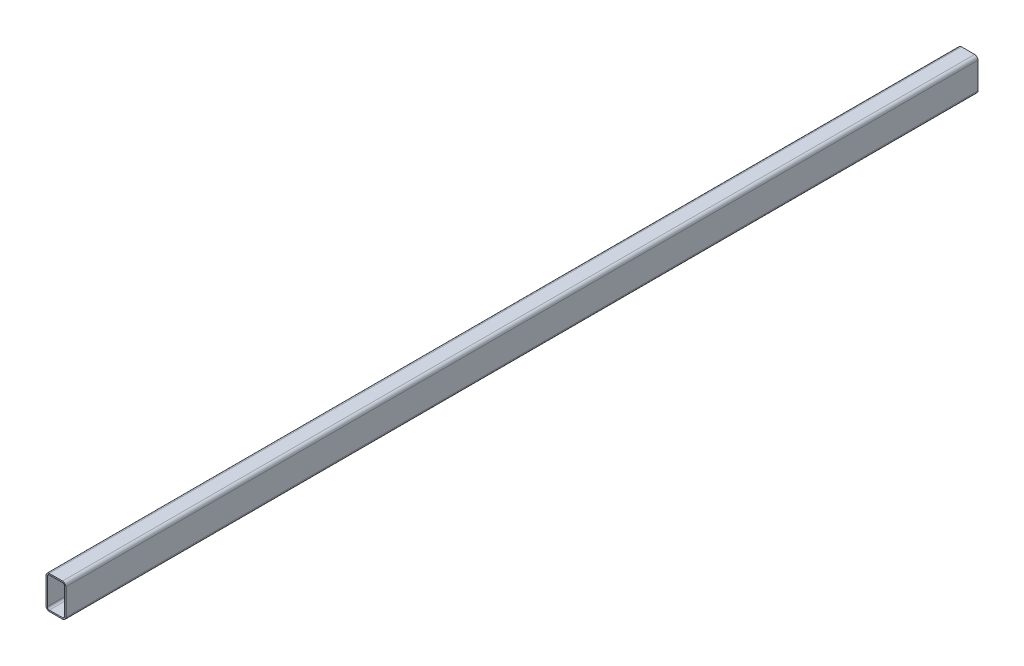
ISO-10303-21;
HEADER;
FILE_DESCRIPTION(('STEP AP214'),'2;1');
FILE_NAME('part.step','',(''),(''),'','','');
FILE_SCHEMA(('AUTOMOTIVE_DESIGN { 1 0 10303 214 1 1 1 1 }'));
ENDSEC;
DATA;
#1=APPLICATION_CONTEXT('core data for automotive mechanical design processes');
#2=APPLICATION_PROTOCOL_DEFINITION('international standard','automotive_design',2000,#1);
#3=PRODUCT_CONTEXT('',#1,'mechanical');
#4=PRODUCT('Part','Part','',(#3));
#5=PRODUCT_RELATED_PRODUCT_CATEGORY('part','',(#4));
#6=PRODUCT_DEFINITION_FORMATION('','',#4);
#7=PRODUCT_DEFINITION_CONTEXT('part definition',#1,'design');
#8=PRODUCT_DEFINITION('design','',#6,#7);
#9=PRODUCT_DEFINITION_SHAPE('','',#8);
#10=(LENGTH_UNIT() NAMED_UNIT(*) SI_UNIT(.MILLI.,.METRE.));
#11=(NAMED_UNIT(*) PLANE_ANGLE_UNIT() SI_UNIT($,.RADIAN.));
#12=(NAMED_UNIT(*) SI_UNIT($,.STERADIAN.) SOLID_ANGLE_UNIT());
#13=UNCERTAINTY_MEASURE_WITH_UNIT(LENGTH_MEASURE(1.E-05),#10,'distance_accuracy_value','');
#14=(GEOMETRIC_REPRESENTATION_CONTEXT(3) GLOBAL_UNCERTAINTY_ASSIGNED_CONTEXT((#13)) GLOBAL_UNIT_ASSIGNED_CONTEXT((#10,
#11,#12)) REPRESENTATION_CONTEXT('',''));
#15=CARTESIAN_POINT('',(0.,0.,0.));
#16=DIRECTION('',(0.,0.,1.));
#17=DIRECTION('',(1.,0.,0.));
#18=AXIS2_PLACEMENT_3D('',#15,#16,#17);
#19=CARTESIAN_POINT('',(-25.,-50.,1725.));
#20=DIRECTION('',(0.,0.,1.));
#21=DIRECTION('',(1.,0.,0.));
#22=AXIS2_PLACEMENT_3D('',#19,#20,#21);
#23=PLANE('',#22);
#24=CARTESIAN_POINT('',(-25.,-50.,1725.));
#25=DIRECTION('',(0.,0.,1.));
#26=DIRECTION('',(1.,0.,0.));
#27=AXIS2_PLACEMENT_3D('',#24,#25,#26);
#28=CIRCLE('',#27,12.5);
#29=CARTESIAN_POINT('',(-37.5,-49.9999999999999,1725.));
#30=VERTEX_POINT('',#29);
#31=CARTESIAN_POINT('',(-24.9999999999999,-62.5,1725.));
#32=VERTEX_POINT('',#31);
#33=EDGE_CURVE('E214',#30,#32,#28,.T.);
#34=ORIENTED_EDGE('',*,*,#33,.T.);
#35=DIRECTION('',(1.,0.,0.));
#36=VECTOR('',#35,1.);
#37=CARTESIAN_POINT('',(-24.9999999999999,-62.5,1725.));
#38=LINE('',#37,#36);
#39=CARTESIAN_POINT('',(24.9999999999999,-62.5,1725.));
#40=VERTEX_POINT('',#39);
#41=EDGE_CURVE('E217',#32,#40,#38,.T.);
#42=ORIENTED_EDGE('',*,*,#41,.T.);
#43=CARTESIAN_POINT('',(25.,-50.,1725.));
#44=DIRECTION('',(0.,0.,1.));
#45=DIRECTION('',(-1.,0.,0.));
#46=AXIS2_PLACEMENT_3D('',#43,#44,#45);
#47=CIRCLE('',#46,12.5);
#48=CARTESIAN_POINT('',(37.5,-49.9999999999999,1725.));
#49=VERTEX_POINT('',#48);
#50=EDGE_CURVE('E220',#40,#49,#47,.T.);
#51=ORIENTED_EDGE('',*,*,#50,.T.);
#52=DIRECTION('',(0.,1.,0.));
#53=VECTOR('',#52,1.);
#54=CARTESIAN_POINT('',(37.5,0.,1725.));
#55=LINE('',#54,#53);
#56=CARTESIAN_POINT('',(37.5,49.9999999999999,1725.));
#57=VERTEX_POINT('',#56);
#58=EDGE_CURVE('E222',#49,#57,#55,.T.);
#59=ORIENTED_EDGE('',*,*,#58,.T.);
#60=CARTESIAN_POINT('',(25.,50.,1725.));
#61=DIRECTION('',(0.,0.,1.));
#62=DIRECTION('',(1.,0.,0.));
#63=AXIS2_PLACEMENT_3D('',#60,#61,#62);
#64=CIRCLE('',#63,12.5);
#65=CARTESIAN_POINT('',(24.9999999999999,62.5,1725.));
#66=VERTEX_POINT('',#65);
#67=EDGE_CURVE('E224',#57,#66,#64,.T.);
#68=ORIENTED_EDGE('',*,*,#67,.T.);
#69=DIRECTION('',(-1.,0.,0.));
#70=VECTOR('',#69,1.);
#71=CARTESIAN_POINT('',(-24.9999999999999,62.5,1725.));
#72=LINE('',#71,#70);
#73=CARTESIAN_POINT('',(-24.9999999999999,62.5,1725.));
#74=VERTEX_POINT('',#73);
#75=EDGE_CURVE('E226',#66,#74,#72,.T.);
#76=ORIENTED_EDGE('',*,*,#75,.T.);
#77=CARTESIAN_POINT('',(-25.,50.,1725.));
#78=DIRECTION('',(0.,0.,1.));
#79=DIRECTION('',(-1.,0.,0.));
#80=AXIS2_PLACEMENT_3D('',#77,#78,#79);
#81=CIRCLE('',#80,12.5);
#82=CARTESIAN_POINT('',(-37.5,49.9999999999999,1725.));
#83=VERTEX_POINT('',#82);
#84=EDGE_CURVE('E228',#74,#83,#81,.T.);
#85=ORIENTED_EDGE('',*,*,#84,.T.);
#86=DIRECTION('',(0.,-1.,0.));
#87=VECTOR('',#86,1.);
#88=CARTESIAN_POINT('',(-37.5,0.,1725.));
#89=LINE('',#88,#87);
#90=EDGE_CURVE('E230',#83,#30,#89,.T.);
#91=ORIENTED_EDGE('',*,*,#90,.T.);
#92=EDGE_LOOP('',(#34,#42,#51,#59,#68,#76,#85,#91));
#93=FACE_BOUND('',#92,.T.);
#94=DIRECTION('',(1.,0.,0.));
#95=VECTOR('',#94,1.);
#96=CARTESIAN_POINT('',(-24.9999999999999,-57.5,1725.));
#97=LINE('',#96,#95);
#98=CARTESIAN_POINT('',(-24.9999999999999,-57.5,1725.));
#99=VERTEX_POINT('',#98);
#100=CARTESIAN_POINT('',(24.9999999999999,-57.5,1725.));
#101=VERTEX_POINT('',#100);
#102=EDGE_CURVE('E156',#99,#101,#97,.T.);
#103=ORIENTED_EDGE('',*,*,#102,.F.);
#104=CARTESIAN_POINT('',(-25.,-50.,1725.));
#105=DIRECTION('',(0.,0.,1.));
#106=DIRECTION('',(1.,0.,0.));
#107=AXIS2_PLACEMENT_3D('',#104,#105,#106);
#108=CIRCLE('',#107,7.5);
#109=CARTESIAN_POINT('',(-32.5,-49.9999999999999,1725.));
#110=VERTEX_POINT('',#109);
#111=EDGE_CURVE('E148',#110,#99,#108,.T.);
#112=ORIENTED_EDGE('',*,*,#111,.F.);
#113=DIRECTION('',(0.,-1.,0.));
#114=VECTOR('',#113,1.);
#115=CARTESIAN_POINT('',(-32.5,0.,1725.));
#116=LINE('',#115,#114);
#117=CARTESIAN_POINT('',(-32.5,49.9999999999999,1725.));
#118=VERTEX_POINT('',#117);
#119=EDGE_CURVE('E181',#118,#110,#116,.T.);
#120=ORIENTED_EDGE('',*,*,#119,.F.);
#121=CARTESIAN_POINT('',(-25.,50.,1725.));
#122=DIRECTION('',(0.,0.,1.));
#123=DIRECTION('',(-1.,0.,0.));
#124=AXIS2_PLACEMENT_3D('',#121,#122,#123);
#125=CIRCLE('',#124,7.5);
#126=CARTESIAN_POINT('',(-25.,57.5,1725.));
#127=VERTEX_POINT('',#126);
#128=EDGE_CURVE('E179',#127,#118,#125,.T.);
#129=ORIENTED_EDGE('',*,*,#128,.F.);
#130=DIRECTION('',(-1.,0.,0.));
#131=VECTOR('',#130,1.);
#132=CARTESIAN_POINT('',(-25.,57.5,1725.));
#133=LINE('',#132,#131);
#134=CARTESIAN_POINT('',(25.,57.5,1725.));
#135=VERTEX_POINT('',#134);
#136=EDGE_CURVE('E177',#135,#127,#133,.T.);
#137=ORIENTED_EDGE('',*,*,#136,.F.);
#138=CARTESIAN_POINT('',(25.,50.,1725.));
#139=DIRECTION('',(0.,0.,1.));
#140=DIRECTION('',(1.,0.,0.));
#141=AXIS2_PLACEMENT_3D('',#138,#139,#140);
#142=CIRCLE('',#141,7.5);
#143=CARTESIAN_POINT('',(32.5,49.9999999999999,1725.));
#144=VERTEX_POINT('',#143);
#145=EDGE_CURVE('E175',#144,#135,#142,.T.);
#146=ORIENTED_EDGE('',*,*,#145,.F.);
#147=DIRECTION('',(0.,1.,0.));
#148=VECTOR('',#147,1.);
#149=CARTESIAN_POINT('',(32.5,0.,1725.));
#150=LINE('',#149,#148);
#151=CARTESIAN_POINT('',(32.5,-49.9999999999999,1725.));
#152=VERTEX_POINT('',#151);
#153=EDGE_CURVE('E171',#152,#144,#150,.T.);
#154=ORIENTED_EDGE('',*,*,#153,.F.);
#155=CARTESIAN_POINT('',(25.,-50.,1725.));
#156=DIRECTION('',(0.,0.,1.));
#157=DIRECTION('',(-1.,0.,0.));
#158=AXIS2_PLACEMENT_3D('',#155,#156,#157);
#159=CIRCLE('',#158,7.5);
#160=EDGE_CURVE('E169',#101,#152,#159,.T.);
#161=ORIENTED_EDGE('',*,*,#160,.F.);
#162=EDGE_LOOP('',(#103,#112,#120,#129,#137,#146,#154,#161));
#163=FACE_BOUND('',#162,.T.);
#164=ADVANCED_FACE('F35',(#93,#163),#23,.T.);
#165=CARTESIAN_POINT('',(-25.,-50.,-1725.));
#166=DIRECTION('',(0.,0.,1.));
#167=DIRECTION('',(1.,0.,0.));
#168=AXIS2_PLACEMENT_3D('',#165,#166,#167);
#169=PLANE('',#168);
#170=CARTESIAN_POINT('',(-25.,-50.,-1725.));
#171=DIRECTION('',(0.,0.,1.));
#172=DIRECTION('',(1.,0.,0.));
#173=AXIS2_PLACEMENT_3D('',#170,#171,#172);
#174=CIRCLE('',#173,12.5);
#175=CARTESIAN_POINT('',(-37.5,-49.9999999999999,-1725.));
#176=VERTEX_POINT('',#175);
#177=CARTESIAN_POINT('',(-24.9999999999999,-62.5,-1725.));
#178=VERTEX_POINT('',#177);
#179=EDGE_CURVE('E164',#176,#178,#174,.T.);
#180=ORIENTED_EDGE('',*,*,#179,.F.);
#181=DIRECTION('',(0.,-1.,0.));
#182=VECTOR('',#181,1.);
#183=CARTESIAN_POINT('',(-37.5,0.,-1725.));
#184=LINE('',#183,#182);
#185=CARTESIAN_POINT('',(-37.5,49.9999999999999,-1725.));
#186=VERTEX_POINT('',#185);
#187=EDGE_CURVE('E218',#186,#176,#184,.T.);
#188=ORIENTED_EDGE('',*,*,#187,.F.);
#189=CARTESIAN_POINT('',(-25.,50.,-1725.));
#190=DIRECTION('',(0.,0.,1.));
#191=DIRECTION('',(-1.,0.,0.));
#192=AXIS2_PLACEMENT_3D('',#189,#190,#191);
#193=CIRCLE('',#192,12.5);
#194=CARTESIAN_POINT('',(-24.9999999999999,62.5,-1725.));
#195=VERTEX_POINT('',#194);
#196=EDGE_CURVE('E246',#195,#186,#193,.T.);
#197=ORIENTED_EDGE('',*,*,#196,.F.);
#198=DIRECTION('',(-1.,0.,0.));
#199=VECTOR('',#198,1.);
#200=CARTESIAN_POINT('',(-24.9999999999999,62.5,-1725.));
#201=LINE('',#200,#199);
#202=CARTESIAN_POINT('',(24.9999999999999,62.5,-1725.));
#203=VERTEX_POINT('',#202);
#204=EDGE_CURVE('E244',#203,#195,#201,.T.);
#205=ORIENTED_EDGE('',*,*,#204,.F.);
#206=CARTESIAN_POINT('',(25.,50.,-1725.));
#207=DIRECTION('',(0.,0.,1.));
#208=DIRECTION('',(1.,0.,0.));
#209=AXIS2_PLACEMENT_3D('',#206,#207,#208);
#210=CIRCLE('',#209,12.5);
#211=CARTESIAN_POINT('',(37.5,49.9999999999999,-1725.));
#212=VERTEX_POINT('',#211);
#213=EDGE_CURVE('E242',#212,#203,#210,.T.);
#214=ORIENTED_EDGE('',*,*,#213,.F.);
#215=DIRECTION('',(0.,1.,0.));
#216=VECTOR('',#215,1.);
#217=CARTESIAN_POINT('',(37.5,0.,-1725.));
#218=LINE('',#217,#216);
#219=CARTESIAN_POINT('',(37.5,-49.9999999999999,-1725.));
#220=VERTEX_POINT('',#219);
#221=EDGE_CURVE('E240',#220,#212,#218,.T.);
#222=ORIENTED_EDGE('',*,*,#221,.F.);
#223=CARTESIAN_POINT('',(25.,-50.,-1725.));
#224=DIRECTION('',(0.,0.,1.));
#225=DIRECTION('',(-1.,0.,0.));
#226=AXIS2_PLACEMENT_3D('',#223,#224,#225);
#227=CIRCLE('',#226,12.5);
#228=CARTESIAN_POINT('',(24.9999999999999,-62.5,-1725.));
#229=VERTEX_POINT('',#228);
#230=EDGE_CURVE('E237',#229,#220,#227,.T.);
#231=ORIENTED_EDGE('',*,*,#230,.F.);
#232=DIRECTION('',(1.,0.,0.));
#233=VECTOR('',#232,1.);
#234=CARTESIAN_POINT('',(24.9999999999999,-62.5,-1725.));
#235=LINE('',#234,#233);
#236=EDGE_CURVE('E235',#178,#229,#235,.T.);
#237=ORIENTED_EDGE('',*,*,#236,.F.);
#238=EDGE_LOOP('',(#180,#188,#197,#205,#214,#222,#231,#237));
#239=FACE_BOUND('',#238,.T.);
#240=CARTESIAN_POINT('',(-25.,-50.,-1725.));
#241=DIRECTION('',(0.,0.,1.));
#242=DIRECTION('',(1.,0.,0.));
#243=AXIS2_PLACEMENT_3D('',#240,#241,#242);
#244=CIRCLE('',#243,7.5);
#245=CARTESIAN_POINT('',(-32.5,-49.9999999999999,-1725.));
#246=VERTEX_POINT('',#245);
#247=CARTESIAN_POINT('',(-24.9999999999999,-57.5,-1725.));
#248=VERTEX_POINT('',#247);
#249=EDGE_CURVE('E58',#246,#248,#244,.T.);
#250=ORIENTED_EDGE('',*,*,#249,.T.);
#251=DIRECTION('',(1.,0.,0.));
#252=VECTOR('',#251,1.);
#253=CARTESIAN_POINT('',(24.9999999999999,-57.5,-1725.));
#254=LINE('',#253,#252);
#255=CARTESIAN_POINT('',(24.9999999999999,-57.5,-1725.));
#256=VERTEX_POINT('',#255);
#257=EDGE_CURVE('E163',#248,#256,#254,.T.);
#258=ORIENTED_EDGE('',*,*,#257,.T.);
#259=CARTESIAN_POINT('',(25.,-50.,-1725.));
#260=DIRECTION('',(0.,0.,1.));
#261=DIRECTION('',(-1.,0.,0.));
#262=AXIS2_PLACEMENT_3D('',#259,#260,#261);
#263=CIRCLE('',#262,7.5);
#264=CARTESIAN_POINT('',(32.5,-49.9999999999999,-1725.));
#265=VERTEX_POINT('',#264);
#266=EDGE_CURVE('E185',#256,#265,#263,.T.);
#267=ORIENTED_EDGE('',*,*,#266,.T.);
#268=DIRECTION('',(0.,1.,0.));
#269=VECTOR('',#268,1.);
#270=CARTESIAN_POINT('',(32.5,0.,-1725.));
#271=LINE('',#270,#269);
#272=CARTESIAN_POINT('',(32.5,49.9999999999999,-1725.));
#273=VERTEX_POINT('',#272);
#274=EDGE_CURVE('E188',#265,#273,#271,.T.);
#275=ORIENTED_EDGE('',*,*,#274,.T.);
#276=CARTESIAN_POINT('',(25.,50.,-1725.));
#277=DIRECTION('',(0.,0.,1.));
#278=DIRECTION('',(1.,0.,0.));
#279=AXIS2_PLACEMENT_3D('',#276,#277,#278);
#280=CIRCLE('',#279,7.5);
#281=CARTESIAN_POINT('',(25.,57.5,-1725.));
#282=VERTEX_POINT('',#281);
#283=EDGE_CURVE('E191',#273,#282,#280,.T.);
#284=ORIENTED_EDGE('',*,*,#283,.T.);
#285=DIRECTION('',(-1.,0.,0.));
#286=VECTOR('',#285,1.);
#287=CARTESIAN_POINT('',(-25.,57.5,-1725.));
#288=LINE('',#287,#286);
#289=CARTESIAN_POINT('',(-25.,57.5,-1725.));
#290=VERTEX_POINT('',#289);
#291=EDGE_CURVE('E194',#282,#290,#288,.T.);
#292=ORIENTED_EDGE('',*,*,#291,.T.);
#293=CARTESIAN_POINT('',(-25.,50.,-1725.));
#294=DIRECTION('',(0.,0.,1.));
#295=DIRECTION('',(-1.,0.,0.));
#296=AXIS2_PLACEMENT_3D('',#293,#294,#295);
#297=CIRCLE('',#296,7.5);
#298=CARTESIAN_POINT('',(-32.5,49.9999999999999,-1725.));
#299=VERTEX_POINT('',#298);
#300=EDGE_CURVE('E197',#290,#299,#297,.T.);
#301=ORIENTED_EDGE('',*,*,#300,.T.);
#302=DIRECTION('',(0.,-1.,0.));
#303=VECTOR('',#302,1.);
#304=CARTESIAN_POINT('',(-32.5,0.,-1725.));
#305=LINE('',#304,#303);
#306=EDGE_CURVE('E157',#299,#246,#305,.T.);
#307=ORIENTED_EDGE('',*,*,#306,.T.);
#308=EDGE_LOOP('',(#250,#258,#267,#275,#284,#292,#301,#307));
#309=FACE_BOUND('',#308,.T.);
#310=ADVANCED_FACE('F276',(#239,#309),#169,.F.);
#311=CARTESIAN_POINT('',(-25.,-50.,1725.));
#312=DIRECTION('',(0.,0.,-1.));
#313=DIRECTION('',(-1.,0.,0.));
#314=AXIS2_PLACEMENT_3D('',#311,#312,#313);
#315=CYLINDRICAL_SURFACE('',#314,12.5);
#316=ORIENTED_EDGE('',*,*,#179,.T.);
#317=DIRECTION('',(0.,0.,-1.));
#318=VECTOR('',#317,1.);
#319=CARTESIAN_POINT('',(-24.9999999999999,-62.5,1725.));
#320=LINE('',#319,#318);
#321=EDGE_CURVE('E11',#32,#178,#320,.T.);
#322=ORIENTED_EDGE('',*,*,#321,.F.);
#323=ORIENTED_EDGE('',*,*,#33,.F.);
#324=DIRECTION('',(0.,0.,-1.));
#325=VECTOR('',#324,1.);
#326=CARTESIAN_POINT('',(-37.5,-49.9999999999999,1725.));
#327=LINE('',#326,#325);
#328=EDGE_CURVE('E232',#30,#176,#327,.T.);
#329=ORIENTED_EDGE('',*,*,#328,.T.);
#330=EDGE_LOOP('',(#316,#322,#323,#329));
#331=FACE_BOUND('',#330,.T.);
#332=ADVANCED_FACE('F37',(#331),#315,.T.);
#333=CARTESIAN_POINT('',(24.9999999999999,-62.5,1725.));
#334=DIRECTION('',(0.,1.,0.));
#335=DIRECTION('',(0.,0.,1.));
#336=AXIS2_PLACEMENT_3D('',#333,#334,#335);
#337=PLANE('',#336);
#338=ORIENTED_EDGE('',*,*,#236,.T.);
#339=DIRECTION('',(0.,0.,-1.));
#340=VECTOR('',#339,1.);
#341=CARTESIAN_POINT('',(24.9999999999999,-62.5,1725.));
#342=LINE('',#341,#340);
#343=EDGE_CURVE('E43',#40,#229,#342,.T.);
#344=ORIENTED_EDGE('',*,*,#343,.F.);
#345=ORIENTED_EDGE('',*,*,#41,.F.);
#346=ORIENTED_EDGE('',*,*,#321,.T.);
#347=EDGE_LOOP('',(#338,#344,#345,#346));
#348=FACE_BOUND('',#347,.T.);
#349=ADVANCED_FACE('F293',(#348),#337,.F.);
#350=CARTESIAN_POINT('',(25.,-50.,1725.));
#351=DIRECTION('',(0.,0.,-1.));
#352=DIRECTION('',(-1.,0.,0.));
#353=AXIS2_PLACEMENT_3D('',#350,#351,#352);
#354=CYLINDRICAL_SURFACE('',#353,12.5);
#355=ORIENTED_EDGE('',*,*,#230,.T.);
#356=DIRECTION('',(0.,0.,-1.));
#357=VECTOR('',#356,1.);
#358=CARTESIAN_POINT('',(37.5,-49.9999999999999,1725.));
#359=LINE('',#358,#357);
#360=EDGE_CURVE('E264',#49,#220,#359,.T.);
#361=ORIENTED_EDGE('',*,*,#360,.F.);
#362=ORIENTED_EDGE('',*,*,#50,.F.);
#363=ORIENTED_EDGE('',*,*,#343,.T.);
#364=EDGE_LOOP('',(#355,#361,#362,#363));
#365=FACE_BOUND('',#364,.T.);
#366=ADVANCED_FACE('F271',(#365),#354,.T.);
#367=CARTESIAN_POINT('',(37.5,0.,1725.));
#368=DIRECTION('',(-1.,0.,0.));
#369=DIRECTION('',(0.,-1.,0.));
#370=AXIS2_PLACEMENT_3D('',#367,#368,#369);
#371=PLANE('',#370);
#372=ORIENTED_EDGE('',*,*,#221,.T.);
#373=DIRECTION('',(0.,0.,-1.));
#374=VECTOR('',#373,1.);
#375=CARTESIAN_POINT('',(37.5,49.9999999999999,1725.));
#376=LINE('',#375,#374);
#377=EDGE_CURVE('E261',#57,#212,#376,.T.);
#378=ORIENTED_EDGE('',*,*,#377,.F.);
#379=ORIENTED_EDGE('',*,*,#58,.F.);
#380=ORIENTED_EDGE('',*,*,#360,.T.);
#381=EDGE_LOOP('',(#372,#378,#379,#380));
#382=FACE_BOUND('',#381,.T.);
#383=ADVANCED_FACE('F282',(#382),#371,.F.);
#384=CARTESIAN_POINT('',(25.,50.,1725.));
#385=DIRECTION('',(0.,0.,-1.));
#386=DIRECTION('',(-1.,0.,0.));
#387=AXIS2_PLACEMENT_3D('',#384,#385,#386);
#388=CYLINDRICAL_SURFACE('',#387,12.5);
#389=ORIENTED_EDGE('',*,*,#213,.T.);
#390=DIRECTION('',(0.,0.,-1.));
#391=VECTOR('',#390,1.);
#392=CARTESIAN_POINT('',(24.9999999999999,62.5,1725.));
#393=LINE('',#392,#391);
#394=EDGE_CURVE('E258',#66,#203,#393,.T.);
#395=ORIENTED_EDGE('',*,*,#394,.F.);
#396=ORIENTED_EDGE('',*,*,#67,.F.);
#397=ORIENTED_EDGE('',*,*,#377,.T.);
#398=EDGE_LOOP('',(#389,#395,#396,#397));
#399=FACE_BOUND('',#398,.T.);
#400=ADVANCED_FACE('F286',(#399),#388,.T.);
#401=CARTESIAN_POINT('',(-24.9999999999999,62.5,1725.));
#402=DIRECTION('',(0.,-1.,0.));
#403=DIRECTION('',(0.,0.,-1.));
#404=AXIS2_PLACEMENT_3D('',#401,#402,#403);
#405=PLANE('',#404);
#406=ORIENTED_EDGE('',*,*,#204,.T.);
#407=DIRECTION('',(0.,0.,-1.));
#408=VECTOR('',#407,1.);
#409=CARTESIAN_POINT('',(-24.9999999999999,62.5,1725.));
#410=LINE('',#409,#408);
#411=EDGE_CURVE('E255',#74,#195,#410,.T.);
#412=ORIENTED_EDGE('',*,*,#411,.F.);
#413=ORIENTED_EDGE('',*,*,#75,.F.);
#414=ORIENTED_EDGE('',*,*,#394,.T.);
#415=EDGE_LOOP('',(#406,#412,#413,#414));
#416=FACE_BOUND('',#415,.T.);
#417=ADVANCED_FACE('F311',(#416),#405,.F.);
#418=CARTESIAN_POINT('',(-25.,50.,1725.));
#419=DIRECTION('',(0.,0.,-1.));
#420=DIRECTION('',(-1.,0.,0.));
#421=AXIS2_PLACEMENT_3D('',#418,#419,#420);
#422=CYLINDRICAL_SURFACE('',#421,12.5);
#423=ORIENTED_EDGE('',*,*,#196,.T.);
#424=DIRECTION('',(0.,0.,-1.));
#425=VECTOR('',#424,1.);
#426=CARTESIAN_POINT('',(-37.5,49.9999999999999,1725.));
#427=LINE('',#426,#425);
#428=EDGE_CURVE('E252',#83,#186,#427,.T.);
#429=ORIENTED_EDGE('',*,*,#428,.F.);
#430=ORIENTED_EDGE('',*,*,#84,.F.);
#431=ORIENTED_EDGE('',*,*,#411,.T.);
#432=EDGE_LOOP('',(#423,#429,#430,#431));
#433=FACE_BOUND('',#432,.T.);
#434=ADVANCED_FACE('F300',(#433),#422,.T.);
#435=CARTESIAN_POINT('',(-37.5,0.,1725.));
#436=DIRECTION('',(1.,0.,0.));
#437=DIRECTION('',(0.,1.,0.));
#438=AXIS2_PLACEMENT_3D('',#435,#436,#437);
#439=PLANE('',#438);
#440=ORIENTED_EDGE('',*,*,#187,.T.);
#441=ORIENTED_EDGE('',*,*,#328,.F.);
#442=ORIENTED_EDGE('',*,*,#90,.F.);
#443=ORIENTED_EDGE('',*,*,#428,.T.);
#444=EDGE_LOOP('',(#440,#441,#442,#443));
#445=FACE_BOUND('',#444,.T.);
#446=ADVANCED_FACE('F303',(#445),#439,.F.);
#447=CARTESIAN_POINT('',(-25.,-50.,1725.));
#448=DIRECTION('',(0.,0.,-1.));
#449=DIRECTION('',(-1.,0.,0.));
#450=AXIS2_PLACEMENT_3D('',#447,#448,#449);
#451=CYLINDRICAL_SURFACE('',#450,7.5);
#452=ORIENTED_EDGE('',*,*,#249,.F.);
#453=DIRECTION('',(0.,0.,-1.));
#454=VECTOR('',#453,1.);
#455=CARTESIAN_POINT('',(-32.5,-49.9999999999999,1725.));
#456=LINE('',#455,#454);
#457=EDGE_CURVE('E152',#110,#246,#456,.T.);
#458=ORIENTED_EDGE('',*,*,#457,.F.);
#459=ORIENTED_EDGE('',*,*,#111,.T.);
#460=DIRECTION('',(0.,0.,-1.));
#461=VECTOR('',#460,1.);
#462=CARTESIAN_POINT('',(-24.9999999999999,-57.5,1725.));
#463=LINE('',#462,#461);
#464=EDGE_CURVE('E151',#99,#248,#463,.T.);
#465=ORIENTED_EDGE('',*,*,#464,.T.);
#466=EDGE_LOOP('',(#452,#458,#459,#465));
#467=FACE_BOUND('',#466,.T.);
#468=ADVANCED_FACE('F150',(#467),#451,.F.);
#469=CARTESIAN_POINT('',(24.9999999999999,-57.5,1725.));
#470=DIRECTION('',(0.,1.,0.));
#471=DIRECTION('',(0.,0.,1.));
#472=AXIS2_PLACEMENT_3D('',#469,#470,#471);
#473=PLANE('',#472);
#474=ORIENTED_EDGE('',*,*,#257,.F.);
#475=ORIENTED_EDGE('',*,*,#464,.F.);
#476=ORIENTED_EDGE('',*,*,#102,.T.);
#477=DIRECTION('',(0.,0.,-1.));
#478=VECTOR('',#477,1.);
#479=CARTESIAN_POINT('',(24.9999999999999,-57.5,1725.));
#480=LINE('',#479,#478);
#481=EDGE_CURVE('E165',#101,#256,#480,.T.);
#482=ORIENTED_EDGE('',*,*,#481,.T.);
#483=EDGE_LOOP('',(#474,#475,#476,#482));
#484=FACE_BOUND('',#483,.T.);
#485=ADVANCED_FACE('F160',(#484),#473,.T.);
#486=CARTESIAN_POINT('',(25.,-50.,1725.));
#487=DIRECTION('',(0.,0.,-1.));
#488=DIRECTION('',(-1.,0.,0.));
#489=AXIS2_PLACEMENT_3D('',#486,#487,#488);
#490=CYLINDRICAL_SURFACE('',#489,7.5);
#491=ORIENTED_EDGE('',*,*,#266,.F.);
#492=ORIENTED_EDGE('',*,*,#481,.F.);
#493=ORIENTED_EDGE('',*,*,#160,.T.);
#494=DIRECTION('',(0.,0.,-1.));
#495=VECTOR('',#494,1.);
#496=CARTESIAN_POINT('',(32.5,-49.9999999999999,1725.));
#497=LINE('',#496,#495);
#498=EDGE_CURVE('E210',#152,#265,#497,.T.);
#499=ORIENTED_EDGE('',*,*,#498,.T.);
#500=EDGE_LOOP('',(#491,#492,#493,#499));
#501=FACE_BOUND('',#500,.T.);
#502=ADVANCED_FACE('F322',(#501),#490,.F.);
#503=CARTESIAN_POINT('',(32.5,0.,1725.));
#504=DIRECTION('',(-1.,0.,0.));
#505=DIRECTION('',(0.,0.,1.));
#506=AXIS2_PLACEMENT_3D('',#503,#504,#505);
#507=PLANE('',#506);
#508=ORIENTED_EDGE('',*,*,#274,.F.);
#509=ORIENTED_EDGE('',*,*,#498,.F.);
#510=ORIENTED_EDGE('',*,*,#153,.T.);
#511=DIRECTION('',(0.,0.,-1.));
#512=VECTOR('',#511,1.);
#513=CARTESIAN_POINT('',(32.5,49.9999999999999,1725.));
#514=LINE('',#513,#512);
#515=EDGE_CURVE('E208',#144,#273,#514,.T.);
#516=ORIENTED_EDGE('',*,*,#515,.T.);
#517=EDGE_LOOP('',(#508,#509,#510,#516));
#518=FACE_BOUND('',#517,.T.);
#519=ADVANCED_FACE('F325',(#518),#507,.T.);
#520=CARTESIAN_POINT('',(25.,50.,1725.));
#521=DIRECTION('',(0.,0.,-1.));
#522=DIRECTION('',(-1.,0.,0.));
#523=AXIS2_PLACEMENT_3D('',#520,#521,#522);
#524=CYLINDRICAL_SURFACE('',#523,7.5);
#525=ORIENTED_EDGE('',*,*,#283,.F.);
#526=ORIENTED_EDGE('',*,*,#515,.F.);
#527=ORIENTED_EDGE('',*,*,#145,.T.);
#528=DIRECTION('',(0.,0.,-1.));
#529=VECTOR('',#528,1.);
#530=CARTESIAN_POINT('',(25.,57.5,1725.));
#531=LINE('',#530,#529);
#532=EDGE_CURVE('E206',#135,#282,#531,.T.);
#533=ORIENTED_EDGE('',*,*,#532,.T.);
#534=EDGE_LOOP('',(#525,#526,#527,#533));
#535=FACE_BOUND('',#534,.T.);
#536=ADVANCED_FACE('F329',(#535),#524,.F.);
#537=CARTESIAN_POINT('',(-25.,57.5,1725.));
#538=DIRECTION('',(0.,-1.,0.));
#539=DIRECTION('',(0.,0.,-1.));
#540=AXIS2_PLACEMENT_3D('',#537,#538,#539);
#541=PLANE('',#540);
#542=ORIENTED_EDGE('',*,*,#291,.F.);
#543=ORIENTED_EDGE('',*,*,#532,.F.);
#544=ORIENTED_EDGE('',*,*,#136,.T.);
#545=DIRECTION('',(0.,0.,-1.));
#546=VECTOR('',#545,1.);
#547=CARTESIAN_POINT('',(-25.,57.5,1725.));
#548=LINE('',#547,#546);
#549=EDGE_CURVE('E204',#127,#290,#548,.T.);
#550=ORIENTED_EDGE('',*,*,#549,.T.);
#551=EDGE_LOOP('',(#542,#543,#544,#550));
#552=FACE_BOUND('',#551,.T.);
#553=ADVANCED_FACE('F333',(#552),#541,.T.);
#554=CARTESIAN_POINT('',(-25.,50.,1725.));
#555=DIRECTION('',(0.,0.,-1.));
#556=DIRECTION('',(-1.,0.,0.));
#557=AXIS2_PLACEMENT_3D('',#554,#555,#556);
#558=CYLINDRICAL_SURFACE('',#557,7.5);
#559=ORIENTED_EDGE('',*,*,#300,.F.);
#560=ORIENTED_EDGE('',*,*,#549,.F.);
#561=ORIENTED_EDGE('',*,*,#128,.T.);
#562=DIRECTION('',(0.,0.,-1.));
#563=VECTOR('',#562,1.);
#564=CARTESIAN_POINT('',(-32.5,49.9999999999999,1725.));
#565=LINE('',#564,#563);
#566=EDGE_CURVE('E50',#118,#299,#565,.T.);
#567=ORIENTED_EDGE('',*,*,#566,.T.);
#568=EDGE_LOOP('',(#559,#560,#561,#567));
#569=FACE_BOUND('',#568,.T.);
#570=ADVANCED_FACE('F337',(#569),#558,.F.);
#571=CARTESIAN_POINT('',(-32.5,0.,1725.));
#572=DIRECTION('',(1.,0.,0.));
#573=DIRECTION('',(0.,1.,0.));
#574=AXIS2_PLACEMENT_3D('',#571,#572,#573);
#575=PLANE('',#574);
#576=ORIENTED_EDGE('',*,*,#306,.F.);
#577=ORIENTED_EDGE('',*,*,#566,.F.);
#578=ORIENTED_EDGE('',*,*,#119,.T.);
#579=ORIENTED_EDGE('',*,*,#457,.T.);
#580=EDGE_LOOP('',(#576,#577,#578,#579));
#581=FACE_BOUND('',#580,.T.);
#582=ADVANCED_FACE('F341',(#581),#575,.T.);
#583=CLOSED_SHELL('',(#164,#310,#332,#349,#366,#383,#400,#417,#434,#446,#468,#485,#502,#519,
#536,#553,#570,#582));
#584=MANIFOLD_SOLID_BREP('B2',#583);
#585=ADVANCED_BREP_SHAPE_REPRESENTATION('',(#18,#584),#14);
#586=SHAPE_DEFINITION_REPRESENTATION(#9,#585);
ENDSEC;
END-ISO-10303-21;
